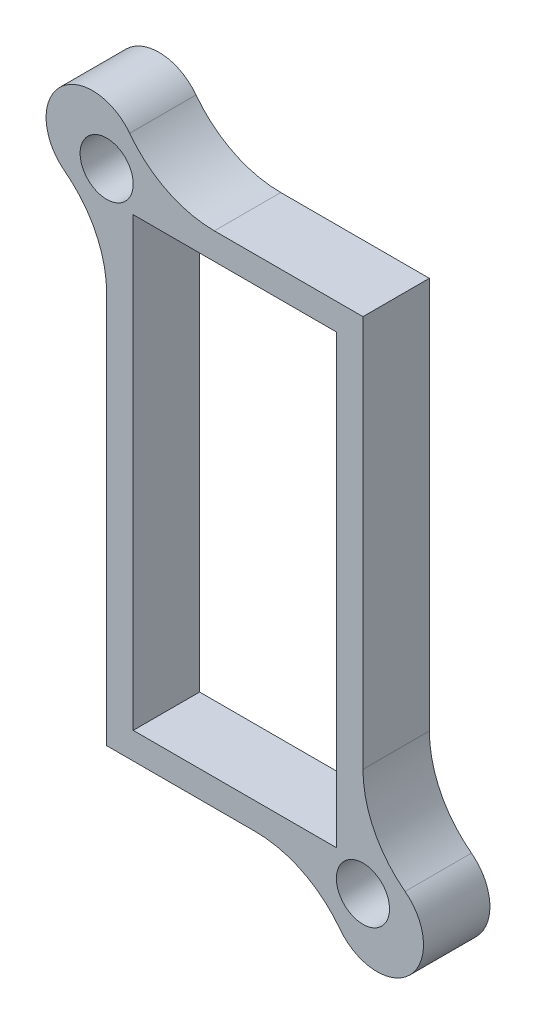
ISO-10303-21;
HEADER;
FILE_DESCRIPTION(('STEP AP214'),'2;1');
FILE_NAME('part.step','',(''),(''),'','','');
FILE_SCHEMA(('AUTOMOTIVE_DESIGN { 1 0 10303 214 1 1 1 1 }'));
ENDSEC;
DATA;
#1=APPLICATION_CONTEXT('core data for automotive mechanical design processes');
#2=APPLICATION_PROTOCOL_DEFINITION('international standard','automotive_design',2000,#1);
#3=PRODUCT_CONTEXT('',#1,'mechanical');
#4=PRODUCT('Part','Part','',(#3));
#5=PRODUCT_RELATED_PRODUCT_CATEGORY('part','',(#4));
#6=PRODUCT_DEFINITION_FORMATION('','',#4);
#7=PRODUCT_DEFINITION_CONTEXT('part definition',#1,'design');
#8=PRODUCT_DEFINITION('design','',#6,#7);
#9=PRODUCT_DEFINITION_SHAPE('','',#8);
#10=(LENGTH_UNIT() NAMED_UNIT(*) SI_UNIT(.MILLI.,.METRE.));
#11=(NAMED_UNIT(*) PLANE_ANGLE_UNIT() SI_UNIT($,.RADIAN.));
#12=(NAMED_UNIT(*) SI_UNIT($,.STERADIAN.) SOLID_ANGLE_UNIT());
#13=UNCERTAINTY_MEASURE_WITH_UNIT(LENGTH_MEASURE(1.E-05),#10,'distance_accuracy_value','');
#14=(GEOMETRIC_REPRESENTATION_CONTEXT(3) GLOBAL_UNCERTAINTY_ASSIGNED_CONTEXT((#13)) GLOBAL_UNIT_ASSIGNED_CONTEXT((#10,
#11,#12)) REPRESENTATION_CONTEXT('',''));
#15=CARTESIAN_POINT('',(0.,0.,0.));
#16=DIRECTION('',(0.,0.,1.));
#17=DIRECTION('',(1.,0.,0.));
#18=AXIS2_PLACEMENT_3D('',#15,#16,#17);
#19=CARTESIAN_POINT('',(0.,0.,2.5));
#20=DIRECTION('',(0.,0.,1.));
#21=DIRECTION('',(1.,0.,0.));
#22=AXIS2_PLACEMENT_3D('',#19,#20,#21);
#23=PLANE('',#22);
#24=CARTESIAN_POINT('',(5.780490460992,-14.591665,2.5));
#25=DIRECTION('',(0.,0.,1.));
#26=DIRECTION('',(1.,0.,0.));
#27=AXIS2_PLACEMENT_3D('',#24,#25,#26);
#28=CIRCLE('',#27,1.);
#29=CARTESIAN_POINT('',(6.780490460992,-14.591665,2.5));
#30=VERTEX_POINT('',#29);
#31=EDGE_CURVE('E284',#30,#30,#28,.T.);
#32=ORIENTED_EDGE('',*,*,#31,.F.);
#33=EDGE_LOOP('',(#32));
#34=FACE_BOUND('',#33,.T.);
#35=CARTESIAN_POINT('',(15.430490460992,-33.408335,2.5));
#36=DIRECTION('',(0.,0.,1.));
#37=DIRECTION('',(1.,0.,0.));
#38=AXIS2_PLACEMENT_3D('',#35,#36,#37);
#39=CIRCLE('',#38,1.);
#40=CARTESIAN_POINT('',(16.430490460992,-33.408335,2.5));
#41=VERTEX_POINT('',#40);
#42=EDGE_CURVE('E366',#41,#41,#39,.T.);
#43=ORIENTED_EDGE('',*,*,#42,.F.);
#44=EDGE_LOOP('',(#43));
#45=FACE_BOUND('',#44,.T.);
#46=DIRECTION('',(1.,0.,0.));
#47=VECTOR('',#46,1.);
#48=CARTESIAN_POINT('',(0.,-33.408335,2.5));
#49=LINE('',#48,#47);
#50=CARTESIAN_POINT('',(5.780490460992,-33.408335,2.5));
#51=VERTEX_POINT('',#50);
#52=CARTESIAN_POINT('',(11.3756389052106,-33.408335,2.5));
#53=VERTEX_POINT('',#52);
#54=EDGE_CURVE('E209',#51,#53,#49,.T.);
#55=ORIENTED_EDGE('',*,*,#54,.T.);
#56=CARTESIAN_POINT('',(11.3756389052106,-37.408335,2.5));
#57=DIRECTION('',(0.,0.,1.));
#58=DIRECTION('',(1.,0.,0.));
#59=AXIS2_PLACEMENT_3D('',#56,#57,#58);
#60=CIRCLE('',#59,4.);
#61=CARTESIAN_POINT('',(14.5653304820254,-34.9946515814886,2.5));
#62=VERTEX_POINT('',#61);
#63=EDGE_CURVE('E252',#53,#62,#60,.F.);
#64=ORIENTED_EDGE('',*,*,#63,.T.);
#65=CARTESIAN_POINT('',(15.9608205468819,-33.9386650858899,2.5));
#66=DIRECTION('',(0.,0.,1.));
#67=DIRECTION('',(1.,0.,0.));
#68=AXIS2_PLACEMENT_3D('',#65,#66,#67);
#69=CIRCLE('',#68,1.75000000000001);
#70=CARTESIAN_POINT('',(17.0168070424806,-32.5431750210334,2.5));
#71=VERTEX_POINT('',#70);
#72=EDGE_CURVE('E361',#62,#71,#69,.T.);
#73=ORIENTED_EDGE('',*,*,#72,.T.);
#74=CARTESIAN_POINT('',(19.430490460992,-29.3534834442186,2.5));
#75=DIRECTION('',(0.,0.,1.));
#76=DIRECTION('',(1.,0.,0.));
#77=AXIS2_PLACEMENT_3D('',#74,#75,#76);
#78=CIRCLE('',#77,4.);
#79=CARTESIAN_POINT('',(15.430490460992,-29.3534834442186,2.5));
#80=VERTEX_POINT('',#79);
#81=EDGE_CURVE('E256',#71,#80,#78,.F.);
#82=ORIENTED_EDGE('',*,*,#81,.T.);
#83=DIRECTION('',(0.,1.,0.));
#84=VECTOR('',#83,1.);
#85=CARTESIAN_POINT('',(15.430490460992,0.,2.5));
#86=LINE('',#85,#84);
#87=CARTESIAN_POINT('',(15.430490460992,-14.591665,2.5));
#88=VERTEX_POINT('',#87);
#89=EDGE_CURVE('E212',#80,#88,#86,.T.);
#90=ORIENTED_EDGE('',*,*,#89,.T.);
#91=DIRECTION('',(1.,0.,0.));
#92=VECTOR('',#91,1.);
#93=CARTESIAN_POINT('',(0.,-14.591665,2.5));
#94=LINE('',#93,#92);
#95=CARTESIAN_POINT('',(9.83534201677334,-14.591665,2.5));
#96=VERTEX_POINT('',#95);
#97=EDGE_CURVE('E216',#96,#88,#94,.T.);
#98=ORIENTED_EDGE('',*,*,#97,.F.);
#99=CARTESIAN_POINT('',(9.83534201677334,-10.591665,2.5));
#100=DIRECTION('',(0.,0.,1.));
#101=DIRECTION('',(1.,0.,0.));
#102=AXIS2_PLACEMENT_3D('',#99,#100,#101);
#103=CIRCLE('',#102,4.);
#104=CARTESIAN_POINT('',(6.64565043995856,-13.0053484185114,2.5));
#105=VERTEX_POINT('',#104);
#106=EDGE_CURVE('E260',#96,#105,#103,.F.);
#107=ORIENTED_EDGE('',*,*,#106,.T.);
#108=CARTESIAN_POINT('',(5.25016037510209,-14.0613349141101,2.5));
#109=DIRECTION('',(0.,0.,1.));
#110=DIRECTION('',(1.,0.,0.));
#111=AXIS2_PLACEMENT_3D('',#108,#109,#110);
#112=CIRCLE('',#111,1.75);
#113=CARTESIAN_POINT('',(4.19417387950337,-15.4568249789666,2.5));
#114=VERTEX_POINT('',#113);
#115=EDGE_CURVE('E280',#105,#114,#112,.T.);
#116=ORIENTED_EDGE('',*,*,#115,.T.);
#117=CARTESIAN_POINT('',(1.780490460992,-18.6465165557814,2.5));
#118=DIRECTION('',(0.,0.,1.));
#119=DIRECTION('',(1.,0.,0.));
#120=AXIS2_PLACEMENT_3D('',#117,#118,#119);
#121=CIRCLE('',#120,4.);
#122=CARTESIAN_POINT('',(5.780490460992,-18.6465165557814,2.5));
#123=VERTEX_POINT('',#122);
#124=EDGE_CURVE('E73',#114,#123,#121,.F.);
#125=ORIENTED_EDGE('',*,*,#124,.T.);
#126=DIRECTION('',(0.,1.,0.));
#127=VECTOR('',#126,1.);
#128=CARTESIAN_POINT('',(5.780490460992,0.,2.5));
#129=LINE('',#128,#127);
#130=EDGE_CURVE('E218',#51,#123,#129,.T.);
#131=ORIENTED_EDGE('',*,*,#130,.F.);
#132=EDGE_LOOP('',(#55,#64,#73,#82,#90,#98,#107,#116,#125,#131));
#133=FACE_BOUND('',#132,.T.);
#134=DIRECTION('',(0.,1.,0.));
#135=VECTOR('',#134,1.);
#136=CARTESIAN_POINT('',(14.430490460992,0.,2.5));
#137=LINE('',#136,#135);
#138=CARTESIAN_POINT('',(14.430490460992,-32.408335,2.5));
#139=VERTEX_POINT('',#138);
#140=CARTESIAN_POINT('',(14.430490460992,-15.591665,2.5));
#141=VERTEX_POINT('',#140);
#142=EDGE_CURVE('E177',#139,#141,#137,.T.);
#143=ORIENTED_EDGE('',*,*,#142,.F.);
#144=DIRECTION('',(1.,0.,0.));
#145=VECTOR('',#144,1.);
#146=CARTESIAN_POINT('',(0.,-32.408335,2.5));
#147=LINE('',#146,#145);
#148=CARTESIAN_POINT('',(6.780490460992,-32.408335,2.5));
#149=VERTEX_POINT('',#148);
#150=EDGE_CURVE('E166',#149,#139,#147,.T.);
#151=ORIENTED_EDGE('',*,*,#150,.F.);
#152=DIRECTION('',(0.,1.,0.));
#153=VECTOR('',#152,1.);
#154=CARTESIAN_POINT('',(6.780490460992,0.,2.5));
#155=LINE('',#154,#153);
#156=CARTESIAN_POINT('',(6.780490460992,-15.591665,2.5));
#157=VERTEX_POINT('',#156);
#158=EDGE_CURVE('E191',#149,#157,#155,.T.);
#159=ORIENTED_EDGE('',*,*,#158,.T.);
#160=DIRECTION('',(1.,0.,0.));
#161=VECTOR('',#160,1.);
#162=CARTESIAN_POINT('',(0.,-15.591665,2.5));
#163=LINE('',#162,#161);
#164=EDGE_CURVE('E189',#157,#141,#163,.T.);
#165=ORIENTED_EDGE('',*,*,#164,.T.);
#166=EDGE_LOOP('',(#143,#151,#159,#165));
#167=FACE_BOUND('',#166,.T.);
#168=ADVANCED_FACE('F65',(#34,#45,#133,#167),#23,.T.);
#169=CARTESIAN_POINT('',(0.,0.,0.));
#170=DIRECTION('',(0.,0.,1.));
#171=DIRECTION('',(1.,0.,0.));
#172=AXIS2_PLACEMENT_3D('',#169,#170,#171);
#173=PLANE('',#172);
#174=DIRECTION('',(0.,1.,0.));
#175=VECTOR('',#174,1.);
#176=CARTESIAN_POINT('',(15.430490460992,0.,0.));
#177=LINE('',#176,#175);
#178=CARTESIAN_POINT('',(15.430490460992,-29.3534834442186,0.));
#179=VERTEX_POINT('',#178);
#180=CARTESIAN_POINT('',(15.430490460992,-14.591665,0.));
#181=VERTEX_POINT('',#180);
#182=EDGE_CURVE('E223',#179,#181,#177,.T.);
#183=ORIENTED_EDGE('',*,*,#182,.F.);
#184=CARTESIAN_POINT('',(19.430490460992,-29.3534834442186,0.));
#185=DIRECTION('',(0.,0.,1.));
#186=DIRECTION('',(1.,0.,0.));
#187=AXIS2_PLACEMENT_3D('',#184,#185,#186);
#188=CIRCLE('',#187,4.);
#189=CARTESIAN_POINT('',(17.0168070424806,-32.5431750210334,0.));
#190=VERTEX_POINT('',#189);
#191=EDGE_CURVE('E258',#179,#190,#188,.T.);
#192=ORIENTED_EDGE('',*,*,#191,.T.);
#193=CARTESIAN_POINT('',(15.9608205468819,-33.9386650858899,0.));
#194=DIRECTION('',(0.,0.,1.));
#195=DIRECTION('',(1.,0.,0.));
#196=AXIS2_PLACEMENT_3D('',#193,#194,#195);
#197=CIRCLE('',#196,1.75000000000001);
#198=CARTESIAN_POINT('',(14.5653304820254,-34.9946515814886,0.));
#199=VERTEX_POINT('',#198);
#200=EDGE_CURVE('E285',#190,#199,#197,.F.);
#201=ORIENTED_EDGE('',*,*,#200,.T.);
#202=CARTESIAN_POINT('',(11.3756389052106,-37.408335,0.));
#203=DIRECTION('',(0.,0.,1.));
#204=DIRECTION('',(1.,0.,0.));
#205=AXIS2_PLACEMENT_3D('',#202,#203,#204);
#206=CIRCLE('',#205,4.);
#207=CARTESIAN_POINT('',(11.3756389052106,-33.408335,0.));
#208=VERTEX_POINT('',#207);
#209=EDGE_CURVE('E254',#199,#208,#206,.T.);
#210=ORIENTED_EDGE('',*,*,#209,.T.);
#211=DIRECTION('',(1.,0.,0.));
#212=VECTOR('',#211,1.);
#213=CARTESIAN_POINT('',(0.,-33.408335,0.));
#214=LINE('',#213,#212);
#215=CARTESIAN_POINT('',(5.780490460992,-33.408335,0.));
#216=VERTEX_POINT('',#215);
#217=EDGE_CURVE('E185',#216,#208,#214,.T.);
#218=ORIENTED_EDGE('',*,*,#217,.F.);
#219=DIRECTION('',(0.,1.,0.));
#220=VECTOR('',#219,1.);
#221=CARTESIAN_POINT('',(5.780490460992,0.,0.));
#222=LINE('',#221,#220);
#223=CARTESIAN_POINT('',(5.780490460992,-18.6465165557814,0.));
#224=VERTEX_POINT('',#223);
#225=EDGE_CURVE('E213',#216,#224,#222,.T.);
#226=ORIENTED_EDGE('',*,*,#225,.T.);
#227=CARTESIAN_POINT('',(1.780490460992,-18.6465165557814,0.));
#228=DIRECTION('',(0.,0.,1.));
#229=DIRECTION('',(1.,0.,0.));
#230=AXIS2_PLACEMENT_3D('',#227,#228,#229);
#231=CIRCLE('',#230,4.);
#232=CARTESIAN_POINT('',(4.19417387950337,-15.4568249789666,0.));
#233=VERTEX_POINT('',#232);
#234=EDGE_CURVE('E12',#224,#233,#231,.T.);
#235=ORIENTED_EDGE('',*,*,#234,.T.);
#236=CARTESIAN_POINT('',(5.25016037510209,-14.0613349141101,0.));
#237=DIRECTION('',(0.,0.,1.));
#238=DIRECTION('',(1.,0.,0.));
#239=AXIS2_PLACEMENT_3D('',#236,#237,#238);
#240=CIRCLE('',#239,1.75);
#241=CARTESIAN_POINT('',(6.64565043995856,-13.0053484185114,0.));
#242=VERTEX_POINT('',#241);
#243=EDGE_CURVE('E198',#233,#242,#240,.F.);
#244=ORIENTED_EDGE('',*,*,#243,.T.);
#245=CARTESIAN_POINT('',(9.83534201677334,-10.591665,0.));
#246=DIRECTION('',(0.,0.,1.));
#247=DIRECTION('',(1.,0.,0.));
#248=AXIS2_PLACEMENT_3D('',#245,#246,#247);
#249=CIRCLE('',#248,4.);
#250=CARTESIAN_POINT('',(9.83534201677334,-14.591665,0.));
#251=VERTEX_POINT('',#250);
#252=EDGE_CURVE('E262',#242,#251,#249,.T.);
#253=ORIENTED_EDGE('',*,*,#252,.T.);
#254=DIRECTION('',(1.,0.,0.));
#255=VECTOR('',#254,1.);
#256=CARTESIAN_POINT('',(0.,-14.591665,0.));
#257=LINE('',#256,#255);
#258=EDGE_CURVE('E226',#251,#181,#257,.T.);
#259=ORIENTED_EDGE('',*,*,#258,.T.);
#260=EDGE_LOOP('',(#183,#192,#201,#210,#218,#226,#235,#244,#253,#259));
#261=FACE_BOUND('',#260,.T.);
#262=CARTESIAN_POINT('',(15.430490460992,-33.408335,0.));
#263=DIRECTION('',(0.,0.,1.));
#264=DIRECTION('',(1.,0.,0.));
#265=AXIS2_PLACEMENT_3D('',#262,#263,#264);
#266=CIRCLE('',#265,1.);
#267=CARTESIAN_POINT('',(16.430490460992,-33.408335,0.));
#268=VERTEX_POINT('',#267);
#269=EDGE_CURVE('E291',#268,#268,#266,.F.);
#270=ORIENTED_EDGE('',*,*,#269,.F.);
#271=EDGE_LOOP('',(#270));
#272=FACE_BOUND('',#271,.T.);
#273=CARTESIAN_POINT('',(5.780490460992,-14.591665,0.));
#274=DIRECTION('',(0.,0.,1.));
#275=DIRECTION('',(1.,0.,0.));
#276=AXIS2_PLACEMENT_3D('',#273,#274,#275);
#277=CIRCLE('',#276,1.);
#278=CARTESIAN_POINT('',(6.780490460992,-14.591665,0.));
#279=VERTEX_POINT('',#278);
#280=EDGE_CURVE('E288',#279,#279,#277,.F.);
#281=ORIENTED_EDGE('',*,*,#280,.F.);
#282=EDGE_LOOP('',(#281));
#283=FACE_BOUND('',#282,.T.);
#284=DIRECTION('',(1.,0.,0.));
#285=VECTOR('',#284,1.);
#286=CARTESIAN_POINT('',(0.,-32.408335,0.));
#287=LINE('',#286,#285);
#288=CARTESIAN_POINT('',(6.780490460992,-32.408335,0.));
#289=VERTEX_POINT('',#288);
#290=CARTESIAN_POINT('',(14.430490460992,-32.408335,0.));
#291=VERTEX_POINT('',#290);
#292=EDGE_CURVE('E196',#289,#291,#287,.T.);
#293=ORIENTED_EDGE('',*,*,#292,.T.);
#294=DIRECTION('',(0.,1.,0.));
#295=VECTOR('',#294,1.);
#296=CARTESIAN_POINT('',(14.430490460992,0.,0.));
#297=LINE('',#296,#295);
#298=CARTESIAN_POINT('',(14.430490460992,-15.591665,0.));
#299=VERTEX_POINT('',#298);
#300=EDGE_CURVE('E184',#291,#299,#297,.T.);
#301=ORIENTED_EDGE('',*,*,#300,.T.);
#302=DIRECTION('',(1.,0.,0.));
#303=VECTOR('',#302,1.);
#304=CARTESIAN_POINT('',(0.,-15.591665,0.));
#305=LINE('',#304,#303);
#306=CARTESIAN_POINT('',(6.780490460992,-15.591665,0.));
#307=VERTEX_POINT('',#306);
#308=EDGE_CURVE('E200',#307,#299,#305,.T.);
#309=ORIENTED_EDGE('',*,*,#308,.F.);
#310=DIRECTION('',(0.,1.,0.));
#311=VECTOR('',#310,1.);
#312=CARTESIAN_POINT('',(6.780490460992,0.,0.));
#313=LINE('',#312,#311);
#314=EDGE_CURVE('E178',#289,#307,#313,.T.);
#315=ORIENTED_EDGE('',*,*,#314,.F.);
#316=EDGE_LOOP('',(#293,#301,#309,#315));
#317=FACE_BOUND('',#316,.T.);
#318=ADVANCED_FACE('F268',(#261,#272,#283,#317),#173,.F.);
#319=CARTESIAN_POINT('',(0.,-33.408335,2.5));
#320=DIRECTION('',(0.,1.,0.));
#321=DIRECTION('',(0.,0.,1.));
#322=AXIS2_PLACEMENT_3D('',#319,#320,#321);
#323=PLANE('',#322);
#324=ORIENTED_EDGE('',*,*,#217,.T.);
#325=DIRECTION('',(0.,0.,1.));
#326=VECTOR('',#325,1.);
#327=CARTESIAN_POINT('',(11.3756389052106,-33.408335,2.5));
#328=LINE('',#327,#326);
#329=EDGE_CURVE('E233',#208,#53,#328,.T.);
#330=ORIENTED_EDGE('',*,*,#329,.T.);
#331=ORIENTED_EDGE('',*,*,#54,.F.);
#332=DIRECTION('',(0.,0.,-1.));
#333=VECTOR('',#332,1.);
#334=CARTESIAN_POINT('',(5.780490460992,-33.408335,2.5));
#335=LINE('',#334,#333);
#336=EDGE_CURVE('E220',#51,#216,#335,.T.);
#337=ORIENTED_EDGE('',*,*,#336,.T.);
#338=EDGE_LOOP('',(#324,#330,#331,#337));
#339=FACE_BOUND('',#338,.T.);
#340=ADVANCED_FACE('F301',(#339),#323,.F.);
#341=CARTESIAN_POINT('',(15.430490460992,0.,2.5));
#342=DIRECTION('',(-1.,0.,0.));
#343=DIRECTION('',(0.,0.,1.));
#344=AXIS2_PLACEMENT_3D('',#341,#342,#343);
#345=PLANE('',#344);
#346=ORIENTED_EDGE('',*,*,#89,.F.);
#347=DIRECTION('',(0.,0.,1.));
#348=VECTOR('',#347,1.);
#349=CARTESIAN_POINT('',(15.430490460992,-29.3534834442186,2.5));
#350=LINE('',#349,#348);
#351=EDGE_CURVE('E241',#80,#179,#350,.F.);
#352=ORIENTED_EDGE('',*,*,#351,.T.);
#353=ORIENTED_EDGE('',*,*,#182,.T.);
#354=DIRECTION('',(0.,0.,-1.));
#355=VECTOR('',#354,1.);
#356=CARTESIAN_POINT('',(15.430490460992,-14.591665,2.5));
#357=LINE('',#356,#355);
#358=EDGE_CURVE('E230',#88,#181,#357,.T.);
#359=ORIENTED_EDGE('',*,*,#358,.F.);
#360=EDGE_LOOP('',(#346,#352,#353,#359));
#361=FACE_BOUND('',#360,.T.);
#362=ADVANCED_FACE('F333',(#361),#345,.F.);
#363=CARTESIAN_POINT('',(0.,-14.591665,2.5));
#364=DIRECTION('',(0.,1.,0.));
#365=DIRECTION('',(0.,0.,1.));
#366=AXIS2_PLACEMENT_3D('',#363,#364,#365);
#367=PLANE('',#366);
#368=ORIENTED_EDGE('',*,*,#258,.F.);
#369=DIRECTION('',(0.,0.,-1.));
#370=VECTOR('',#369,1.);
#371=CARTESIAN_POINT('',(9.83534201677334,-14.591665,2.5));
#372=LINE('',#371,#370);
#373=EDGE_CURVE('E243',#251,#96,#372,.F.);
#374=ORIENTED_EDGE('',*,*,#373,.T.);
#375=ORIENTED_EDGE('',*,*,#97,.T.);
#376=ORIENTED_EDGE('',*,*,#358,.T.);
#377=EDGE_LOOP('',(#368,#374,#375,#376));
#378=FACE_BOUND('',#377,.T.);
#379=ADVANCED_FACE('F275',(#378),#367,.T.);
#380=CARTESIAN_POINT('',(5.780490460992,0.,2.5));
#381=DIRECTION('',(-1.,0.,0.));
#382=DIRECTION('',(0.,0.,1.));
#383=AXIS2_PLACEMENT_3D('',#380,#381,#382);
#384=PLANE('',#383);
#385=ORIENTED_EDGE('',*,*,#130,.T.);
#386=DIRECTION('',(0.,0.,-1.));
#387=VECTOR('',#386,1.);
#388=CARTESIAN_POINT('',(5.780490460992,-18.6465165557814,0.));
#389=LINE('',#388,#387);
#390=EDGE_CURVE('E86',#123,#224,#389,.T.);
#391=ORIENTED_EDGE('',*,*,#390,.T.);
#392=ORIENTED_EDGE('',*,*,#225,.F.);
#393=ORIENTED_EDGE('',*,*,#336,.F.);
#394=EDGE_LOOP('',(#385,#391,#392,#393));
#395=FACE_BOUND('',#394,.T.);
#396=ADVANCED_FACE('F328',(#395),#384,.T.);
#397=CARTESIAN_POINT('',(0.,-32.408335,2.5));
#398=DIRECTION('',(0.,1.,0.));
#399=DIRECTION('',(0.,0.,1.));
#400=AXIS2_PLACEMENT_3D('',#397,#398,#399);
#401=PLANE('',#400);
#402=ORIENTED_EDGE('',*,*,#292,.F.);
#403=DIRECTION('',(0.,0.,-1.));
#404=VECTOR('',#403,1.);
#405=CARTESIAN_POINT('',(6.780490460992,-32.408335,2.5));
#406=LINE('',#405,#404);
#407=EDGE_CURVE('E172',#149,#289,#406,.T.);
#408=ORIENTED_EDGE('',*,*,#407,.F.);
#409=ORIENTED_EDGE('',*,*,#150,.T.);
#410=DIRECTION('',(0.,0.,-1.));
#411=VECTOR('',#410,1.);
#412=CARTESIAN_POINT('',(14.430490460992,-32.408335,2.5));
#413=LINE('',#412,#411);
#414=EDGE_CURVE('E169',#139,#291,#413,.T.);
#415=ORIENTED_EDGE('',*,*,#414,.T.);
#416=EDGE_LOOP('',(#402,#408,#409,#415));
#417=FACE_BOUND('',#416,.T.);
#418=ADVANCED_FACE('F168',(#417),#401,.T.);
#419=CARTESIAN_POINT('',(14.430490460992,0.,2.5));
#420=DIRECTION('',(-1.,0.,0.));
#421=DIRECTION('',(0.,0.,1.));
#422=AXIS2_PLACEMENT_3D('',#419,#420,#421);
#423=PLANE('',#422);
#424=ORIENTED_EDGE('',*,*,#300,.F.);
#425=ORIENTED_EDGE('',*,*,#414,.F.);
#426=ORIENTED_EDGE('',*,*,#142,.T.);
#427=DIRECTION('',(0.,0.,-1.));
#428=VECTOR('',#427,1.);
#429=CARTESIAN_POINT('',(14.430490460992,-15.591665,2.5));
#430=LINE('',#429,#428);
#431=EDGE_CURVE('E186',#141,#299,#430,.T.);
#432=ORIENTED_EDGE('',*,*,#431,.T.);
#433=EDGE_LOOP('',(#424,#425,#426,#432));
#434=FACE_BOUND('',#433,.T.);
#435=ADVANCED_FACE('F181',(#434),#423,.T.);
#436=CARTESIAN_POINT('',(0.,-15.591665,2.5));
#437=DIRECTION('',(0.,1.,0.));
#438=DIRECTION('',(0.,0.,1.));
#439=AXIS2_PLACEMENT_3D('',#436,#437,#438);
#440=PLANE('',#439);
#441=ORIENTED_EDGE('',*,*,#308,.T.);
#442=ORIENTED_EDGE('',*,*,#431,.F.);
#443=ORIENTED_EDGE('',*,*,#164,.F.);
#444=DIRECTION('',(0.,0.,-1.));
#445=VECTOR('',#444,1.);
#446=CARTESIAN_POINT('',(6.780490460992,-15.591665,2.5));
#447=LINE('',#446,#445);
#448=EDGE_CURVE('E206',#157,#307,#447,.T.);
#449=ORIENTED_EDGE('',*,*,#448,.T.);
#450=EDGE_LOOP('',(#441,#442,#443,#449));
#451=FACE_BOUND('',#450,.T.);
#452=ADVANCED_FACE('F309',(#451),#440,.F.);
#453=CARTESIAN_POINT('',(6.780490460992,0.,2.5));
#454=DIRECTION('',(-1.,0.,0.));
#455=DIRECTION('',(0.,0.,1.));
#456=AXIS2_PLACEMENT_3D('',#453,#454,#455);
#457=PLANE('',#456);
#458=ORIENTED_EDGE('',*,*,#314,.T.);
#459=ORIENTED_EDGE('',*,*,#448,.F.);
#460=ORIENTED_EDGE('',*,*,#158,.F.);
#461=ORIENTED_EDGE('',*,*,#407,.T.);
#462=EDGE_LOOP('',(#458,#459,#460,#461));
#463=FACE_BOUND('',#462,.T.);
#464=ADVANCED_FACE('F306',(#463),#457,.F.);
#465=CARTESIAN_POINT('',(5.780490460992,-14.591665,-4.94974746830587));
#466=DIRECTION('',(0.,0.,1.));
#467=DIRECTION('',(1.,0.,0.));
#468=AXIS2_PLACEMENT_3D('',#465,#466,#467);
#469=CYLINDRICAL_SURFACE('',#468,1.);
#470=ORIENTED_EDGE('',*,*,#31,.T.);
#471=EDGE_LOOP('',(#470));
#472=FACE_BOUND('',#471,.T.);
#473=ORIENTED_EDGE('',*,*,#280,.T.);
#474=EDGE_LOOP('',(#473));
#475=FACE_BOUND('',#474,.T.);
#476=ADVANCED_FACE('F297',(#472,#475),#469,.F.);
#477=CARTESIAN_POINT('',(5.25016037510209,-14.0613349141101,-4.94974746830587));
#478=DIRECTION('',(0.,0.,1.));
#479=DIRECTION('',(1.,0.,0.));
#480=AXIS2_PLACEMENT_3D('',#477,#478,#479);
#481=CYLINDRICAL_SURFACE('',#480,1.75);
#482=ORIENTED_EDGE('',*,*,#115,.F.);
#483=DIRECTION('',(0.,0.,1.));
#484=VECTOR('',#483,1.);
#485=CARTESIAN_POINT('',(6.64565043995856,-13.0053484185114,-4.94974746830587));
#486=LINE('',#485,#484);
#487=EDGE_CURVE('E249',#105,#242,#486,.F.);
#488=ORIENTED_EDGE('',*,*,#487,.T.);
#489=ORIENTED_EDGE('',*,*,#243,.F.);
#490=DIRECTION('',(0.,0.,1.));
#491=VECTOR('',#490,1.);
#492=CARTESIAN_POINT('',(4.19417387950337,-15.4568249789666,-4.94974746830587));
#493=LINE('',#492,#491);
#494=EDGE_CURVE('E246',#233,#114,#493,.T.);
#495=ORIENTED_EDGE('',*,*,#494,.T.);
#496=EDGE_LOOP('',(#482,#488,#489,#495));
#497=FACE_BOUND('',#496,.T.);
#498=ADVANCED_FACE('F282',(#497),#481,.T.);
#499=CARTESIAN_POINT('',(15.430490460992,-33.408335,-4.94974746830587));
#500=DIRECTION('',(0.,0.,1.));
#501=DIRECTION('',(1.,0.,0.));
#502=AXIS2_PLACEMENT_3D('',#499,#500,#501);
#503=CYLINDRICAL_SURFACE('',#502,1.);
#504=ORIENTED_EDGE('',*,*,#42,.T.);
#505=EDGE_LOOP('',(#504));
#506=FACE_BOUND('',#505,.T.);
#507=ORIENTED_EDGE('',*,*,#269,.T.);
#508=EDGE_LOOP('',(#507));
#509=FACE_BOUND('',#508,.T.);
#510=ADVANCED_FACE('F378',(#506,#509),#503,.F.);
#511=CARTESIAN_POINT('',(15.9608205468819,-33.9386650858899,-4.94974746830587));
#512=DIRECTION('',(0.,0.,1.));
#513=DIRECTION('',(1.,0.,0.));
#514=AXIS2_PLACEMENT_3D('',#511,#512,#513);
#515=CYLINDRICAL_SURFACE('',#514,1.75000000000001);
#516=ORIENTED_EDGE('',*,*,#72,.F.);
#517=DIRECTION('',(0.,0.,1.));
#518=VECTOR('',#517,1.);
#519=CARTESIAN_POINT('',(14.5653304820254,-34.9946515814886,-4.94974746830587));
#520=LINE('',#519,#518);
#521=EDGE_CURVE('E239',#62,#199,#520,.F.);
#522=ORIENTED_EDGE('',*,*,#521,.T.);
#523=ORIENTED_EDGE('',*,*,#200,.F.);
#524=DIRECTION('',(0.,0.,1.));
#525=VECTOR('',#524,1.);
#526=CARTESIAN_POINT('',(17.0168070424806,-32.5431750210334,-4.94974746830587));
#527=LINE('',#526,#525);
#528=EDGE_CURVE('E236',#190,#71,#527,.T.);
#529=ORIENTED_EDGE('',*,*,#528,.T.);
#530=EDGE_LOOP('',(#516,#522,#523,#529));
#531=FACE_BOUND('',#530,.T.);
#532=ADVANCED_FACE('F344',(#531),#515,.T.);
#533=CARTESIAN_POINT('',(11.3756389052106,-37.408335,-4.94974746830587));
#534=DIRECTION('',(0.,0.,1.));
#535=DIRECTION('',(1.,0.,0.));
#536=AXIS2_PLACEMENT_3D('',#533,#534,#535);
#537=CYLINDRICAL_SURFACE('',#536,4.);
#538=ORIENTED_EDGE('',*,*,#209,.F.);
#539=ORIENTED_EDGE('',*,*,#521,.F.);
#540=ORIENTED_EDGE('',*,*,#63,.F.);
#541=ORIENTED_EDGE('',*,*,#329,.F.);
#542=EDGE_LOOP('',(#538,#539,#540,#541));
#543=FACE_BOUND('',#542,.T.);
#544=ADVANCED_FACE('F340',(#543),#537,.F.);
#545=CARTESIAN_POINT('',(19.430490460992,-29.3534834442186,-4.94974746830587));
#546=DIRECTION('',(0.,0.,1.));
#547=DIRECTION('',(1.,0.,0.));
#548=AXIS2_PLACEMENT_3D('',#545,#546,#547);
#549=CYLINDRICAL_SURFACE('',#548,4.);
#550=ORIENTED_EDGE('',*,*,#191,.F.);
#551=ORIENTED_EDGE('',*,*,#351,.F.);
#552=ORIENTED_EDGE('',*,*,#81,.F.);
#553=ORIENTED_EDGE('',*,*,#528,.F.);
#554=EDGE_LOOP('',(#550,#551,#552,#553));
#555=FACE_BOUND('',#554,.T.);
#556=ADVANCED_FACE('F343',(#555),#549,.F.);
#557=CARTESIAN_POINT('',(9.83534201677334,-10.591665,-4.94974746830587));
#558=DIRECTION('',(0.,0.,1.));
#559=DIRECTION('',(1.,0.,0.));
#560=AXIS2_PLACEMENT_3D('',#557,#558,#559);
#561=CYLINDRICAL_SURFACE('',#560,4.);
#562=ORIENTED_EDGE('',*,*,#252,.F.);
#563=ORIENTED_EDGE('',*,*,#487,.F.);
#564=ORIENTED_EDGE('',*,*,#106,.F.);
#565=ORIENTED_EDGE('',*,*,#373,.F.);
#566=EDGE_LOOP('',(#562,#563,#564,#565));
#567=FACE_BOUND('',#566,.T.);
#568=ADVANCED_FACE('F278',(#567),#561,.F.);
#569=CARTESIAN_POINT('',(1.780490460992,-18.6465165557814,-4.94974746830587));
#570=DIRECTION('',(0.,0.,1.));
#571=DIRECTION('',(1.,0.,0.));
#572=AXIS2_PLACEMENT_3D('',#569,#570,#571);
#573=CYLINDRICAL_SURFACE('',#572,4.);
#574=ORIENTED_EDGE('',*,*,#234,.F.);
#575=ORIENTED_EDGE('',*,*,#390,.F.);
#576=ORIENTED_EDGE('',*,*,#124,.F.);
#577=ORIENTED_EDGE('',*,*,#494,.F.);
#578=EDGE_LOOP('',(#574,#575,#576,#577));
#579=FACE_BOUND('',#578,.T.);
#580=ADVANCED_FACE('F67',(#579),#573,.F.);
#581=CLOSED_SHELL('',(#168,#318,#340,#362,#379,#396,#418,#435,#452,#464,#476,#498,#510,#532,
#544,#556,#568,#580));
#582=MANIFOLD_SOLID_BREP('B2',#581);
#583=ADVANCED_BREP_SHAPE_REPRESENTATION('',(#18,#582),#14);
#584=SHAPE_DEFINITION_REPRESENTATION(#9,#583);
ENDSEC;
END-ISO-10303-21;
